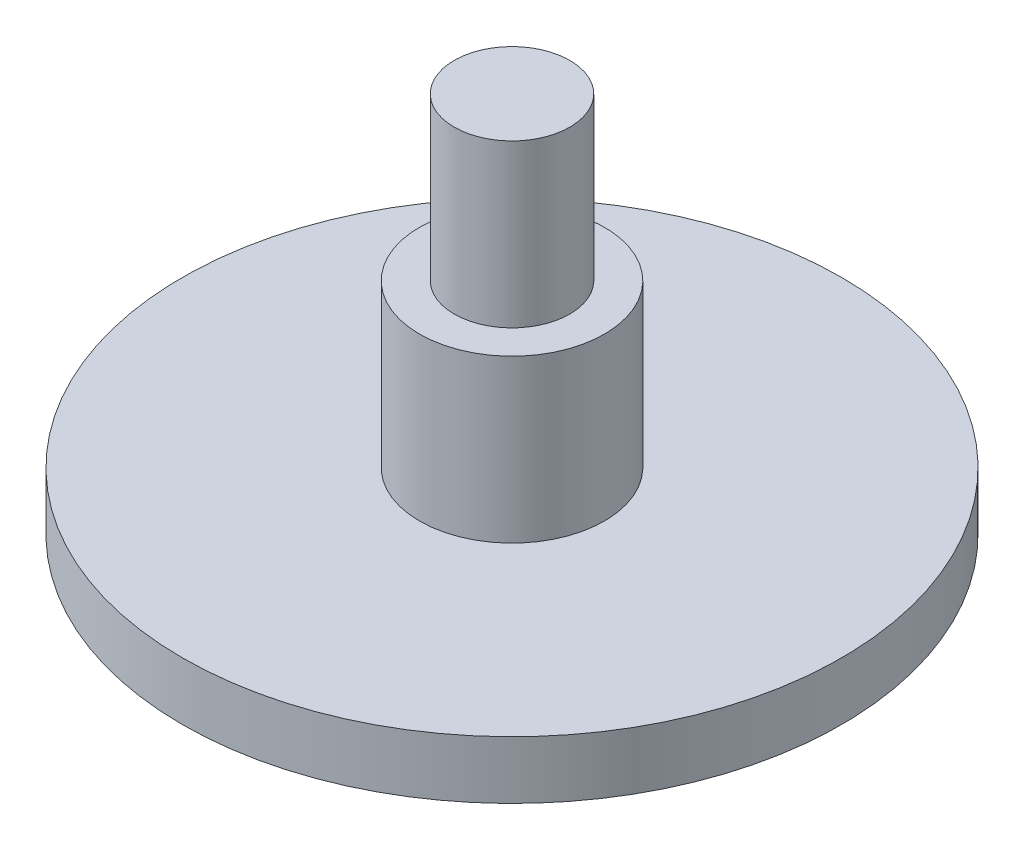
ISO-10303-21;
HEADER;
FILE_DESCRIPTION(('STEP AP214'),'2;1');
FILE_NAME('part.step','',(''),(''),'','','');
FILE_SCHEMA(('AUTOMOTIVE_DESIGN { 1 0 10303 214 1 1 1 1 }'));
ENDSEC;
DATA;
#1=APPLICATION_CONTEXT('core data for automotive mechanical design processes');
#2=APPLICATION_PROTOCOL_DEFINITION('international standard','automotive_design',2000,#1);
#3=PRODUCT_CONTEXT('',#1,'mechanical');
#4=PRODUCT('Part','Part','',(#3));
#5=PRODUCT_RELATED_PRODUCT_CATEGORY('part','',(#4));
#6=PRODUCT_DEFINITION_FORMATION('','',#4);
#7=PRODUCT_DEFINITION_CONTEXT('part definition',#1,'design');
#8=PRODUCT_DEFINITION('design','',#6,#7);
#9=PRODUCT_DEFINITION_SHAPE('','',#8);
#10=(LENGTH_UNIT() NAMED_UNIT(*) SI_UNIT(.MILLI.,.METRE.));
#11=(NAMED_UNIT(*) PLANE_ANGLE_UNIT() SI_UNIT($,.RADIAN.));
#12=(NAMED_UNIT(*) SI_UNIT($,.STERADIAN.) SOLID_ANGLE_UNIT());
#13=UNCERTAINTY_MEASURE_WITH_UNIT(LENGTH_MEASURE(1.E-05),#10,'distance_accuracy_value','');
#14=(GEOMETRIC_REPRESENTATION_CONTEXT(3) GLOBAL_UNCERTAINTY_ASSIGNED_CONTEXT((#13)) GLOBAL_UNIT_ASSIGNED_CONTEXT((#10,
#11,#12)) REPRESENTATION_CONTEXT('',''));
#15=CARTESIAN_POINT('',(0.,0.,0.));
#16=DIRECTION('',(0.,0.,1.));
#17=DIRECTION('',(1.,0.,0.));
#18=AXIS2_PLACEMENT_3D('',#15,#16,#17);
#19=CARTESIAN_POINT('',(0.,5.,0.));
#20=DIRECTION('',(0.,-1.,0.));
#21=DIRECTION('',(0.,0.,-1.));
#22=AXIS2_PLACEMENT_3D('',#19,#20,#21);
#23=CYLINDRICAL_SURFACE('',#22,28.5);
#24=CARTESIAN_POINT('',(0.,5.,0.));
#25=DIRECTION('',(0.,1.,0.));
#26=DIRECTION('',(0.,0.,1.));
#27=AXIS2_PLACEMENT_3D('',#24,#25,#26);
#28=CIRCLE('',#27,28.5);
#29=CARTESIAN_POINT('',(0.,5.,28.5));
#30=VERTEX_POINT('',#29);
#31=EDGE_CURVE('E12',#30,#30,#28,.T.);
#32=ORIENTED_EDGE('',*,*,#31,.F.);
#33=EDGE_LOOP('',(#32));
#34=FACE_BOUND('',#33,.T.);
#35=CARTESIAN_POINT('',(0.,0.,0.));
#36=DIRECTION('',(0.,1.,0.));
#37=DIRECTION('',(0.,0.,1.));
#38=AXIS2_PLACEMENT_3D('',#35,#36,#37);
#39=CIRCLE('',#38,28.5);
#40=CARTESIAN_POINT('',(0.,0.,28.5));
#41=VERTEX_POINT('',#40);
#42=EDGE_CURVE('E47',#41,#41,#39,.T.);
#43=ORIENTED_EDGE('',*,*,#42,.T.);
#44=EDGE_LOOP('',(#43));
#45=FACE_BOUND('',#44,.T.);
#46=ADVANCED_FACE('F44',(#34,#45),#23,.T.);
#47=CARTESIAN_POINT('',(0.,5.,0.));
#48=DIRECTION('',(0.,1.,0.));
#49=DIRECTION('',(0.,0.,1.));
#50=AXIS2_PLACEMENT_3D('',#47,#48,#49);
#51=PLANE('',#50);
#52=CARTESIAN_POINT('',(0.,5.,0.));
#53=DIRECTION('',(0.,1.,0.));
#54=DIRECTION('',(0.,0.,1.));
#55=AXIS2_PLACEMENT_3D('',#52,#53,#54);
#56=CIRCLE('',#55,8.);
#57=CARTESIAN_POINT('',(0.,5.,8.));
#58=VERTEX_POINT('',#57);
#59=EDGE_CURVE('E56',#58,#58,#56,.T.);
#60=ORIENTED_EDGE('',*,*,#59,.F.);
#61=EDGE_LOOP('',(#60));
#62=FACE_BOUND('',#61,.T.);
#63=ORIENTED_EDGE('',*,*,#31,.T.);
#64=EDGE_LOOP('',(#63));
#65=FACE_BOUND('',#64,.T.);
#66=ADVANCED_FACE('F89',(#62,#65),#51,.T.);
#67=CARTESIAN_POINT('',(0.,0.,0.));
#68=DIRECTION('',(0.,1.,0.));
#69=DIRECTION('',(0.,0.,1.));
#70=AXIS2_PLACEMENT_3D('',#67,#68,#69);
#71=PLANE('',#70);
#72=ORIENTED_EDGE('',*,*,#42,.F.);
#73=EDGE_LOOP('',(#72));
#74=FACE_BOUND('',#73,.T.);
#75=ADVANCED_FACE('F85',(#74),#71,.F.);
#76=CARTESIAN_POINT('',(0.,19.,0.));
#77=DIRECTION('',(0.,-1.,0.));
#78=DIRECTION('',(0.,0.,-1.));
#79=AXIS2_PLACEMENT_3D('',#76,#77,#78);
#80=CYLINDRICAL_SURFACE('',#79,8.);
#81=CARTESIAN_POINT('',(0.,19.,0.));
#82=DIRECTION('',(0.,1.,0.));
#83=DIRECTION('',(0.,0.,1.));
#84=AXIS2_PLACEMENT_3D('',#81,#82,#83);
#85=CIRCLE('',#84,8.);
#86=CARTESIAN_POINT('',(0.,19.,8.));
#87=VERTEX_POINT('',#86);
#88=EDGE_CURVE('E54',#87,#87,#85,.T.);
#89=ORIENTED_EDGE('',*,*,#88,.F.);
#90=EDGE_LOOP('',(#89));
#91=FACE_BOUND('',#90,.T.);
#92=ORIENTED_EDGE('',*,*,#59,.T.);
#93=EDGE_LOOP('',(#92));
#94=FACE_BOUND('',#93,.T.);
#95=ADVANCED_FACE('F79',(#91,#94),#80,.T.);
#96=CARTESIAN_POINT('',(0.,19.,0.));
#97=DIRECTION('',(0.,1.,0.));
#98=DIRECTION('',(0.,0.,1.));
#99=AXIS2_PLACEMENT_3D('',#96,#97,#98);
#100=PLANE('',#99);
#101=CARTESIAN_POINT('',(0.,19.,0.));
#102=DIRECTION('',(0.,1.,0.));
#103=DIRECTION('',(0.,0.,1.));
#104=AXIS2_PLACEMENT_3D('',#101,#102,#103);
#105=CIRCLE('',#104,5.);
#106=CARTESIAN_POINT('',(0.,19.,5.));
#107=VERTEX_POINT('',#106);
#108=EDGE_CURVE('E62',#107,#107,#105,.T.);
#109=ORIENTED_EDGE('',*,*,#108,.F.);
#110=EDGE_LOOP('',(#109));
#111=FACE_BOUND('',#110,.T.);
#112=ORIENTED_EDGE('',*,*,#88,.T.);
#113=EDGE_LOOP('',(#112));
#114=FACE_BOUND('',#113,.T.);
#115=ADVANCED_FACE('F73',(#111,#114),#100,.T.);
#116=CARTESIAN_POINT('',(0.,33.,0.));
#117=DIRECTION('',(0.,-1.,0.));
#118=DIRECTION('',(0.,0.,-1.));
#119=AXIS2_PLACEMENT_3D('',#116,#117,#118);
#120=CYLINDRICAL_SURFACE('',#119,5.);
#121=CARTESIAN_POINT('',(0.,33.,0.));
#122=DIRECTION('',(0.,1.,0.));
#123=DIRECTION('',(0.,0.,1.));
#124=AXIS2_PLACEMENT_3D('',#121,#122,#123);
#125=CIRCLE('',#124,5.);
#126=CARTESIAN_POINT('',(0.,33.,5.));
#127=VERTEX_POINT('',#126);
#128=EDGE_CURVE('E59',#127,#127,#125,.T.);
#129=ORIENTED_EDGE('',*,*,#128,.F.);
#130=EDGE_LOOP('',(#129));
#131=FACE_BOUND('',#130,.T.);
#132=ORIENTED_EDGE('',*,*,#108,.T.);
#133=EDGE_LOOP('',(#132));
#134=FACE_BOUND('',#133,.T.);
#135=ADVANCED_FACE('F70',(#131,#134),#120,.T.);
#136=CARTESIAN_POINT('',(0.,33.,0.));
#137=DIRECTION('',(0.,1.,0.));
#138=DIRECTION('',(0.,0.,1.));
#139=AXIS2_PLACEMENT_3D('',#136,#137,#138);
#140=PLANE('',#139);
#141=ORIENTED_EDGE('',*,*,#128,.T.);
#142=EDGE_LOOP('',(#141));
#143=FACE_BOUND('',#142,.T.);
#144=ADVANCED_FACE('F68',(#143),#140,.T.);
#145=CLOSED_SHELL('',(#46,#66,#75,#95,#115,#135,#144));
#146=MANIFOLD_SOLID_BREP('B2',#145);
#147=ADVANCED_BREP_SHAPE_REPRESENTATION('',(#18,#146),#14);
#148=SHAPE_DEFINITION_REPRESENTATION(#9,#147);
ENDSEC;
END-ISO-10303-21;
